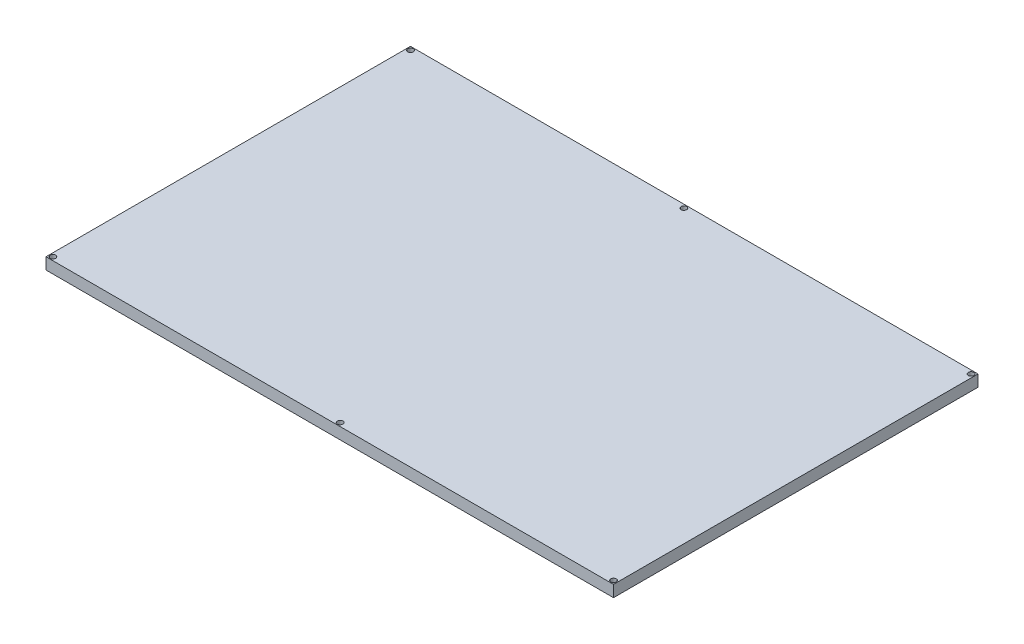
ISO-10303-21;
HEADER;
FILE_DESCRIPTION(('STEP AP214'),'2;1');
FILE_NAME('part.step','',(''),(''),'','','');
FILE_SCHEMA(('AUTOMOTIVE_DESIGN { 1 0 10303 214 1 1 1 1 }'));
ENDSEC;
DATA;
#1=APPLICATION_CONTEXT('core data for automotive mechanical design processes');
#2=APPLICATION_PROTOCOL_DEFINITION('international standard','automotive_design',2000,#1);
#3=PRODUCT_CONTEXT('',#1,'mechanical');
#4=PRODUCT('Part','Part','',(#3));
#5=PRODUCT_RELATED_PRODUCT_CATEGORY('part','',(#4));
#6=PRODUCT_DEFINITION_FORMATION('','',#4);
#7=PRODUCT_DEFINITION_CONTEXT('part definition',#1,'design');
#8=PRODUCT_DEFINITION('design','',#6,#7);
#9=PRODUCT_DEFINITION_SHAPE('','',#8);
#10=(LENGTH_UNIT() NAMED_UNIT(*) SI_UNIT(.MILLI.,.METRE.));
#11=(NAMED_UNIT(*) PLANE_ANGLE_UNIT() SI_UNIT($,.RADIAN.));
#12=(NAMED_UNIT(*) SI_UNIT($,.STERADIAN.) SOLID_ANGLE_UNIT());
#13=UNCERTAINTY_MEASURE_WITH_UNIT(LENGTH_MEASURE(1.E-05),#10,'distance_accuracy_value','');
#14=(GEOMETRIC_REPRESENTATION_CONTEXT(3) GLOBAL_UNCERTAINTY_ASSIGNED_CONTEXT((#13)) GLOBAL_UNIT_ASSIGNED_CONTEXT((#10,
#11,#12)) REPRESENTATION_CONTEXT('',''));
#15=CARTESIAN_POINT('',(0.,0.,0.));
#16=DIRECTION('',(0.,0.,1.));
#17=DIRECTION('',(1.,0.,0.));
#18=AXIS2_PLACEMENT_3D('',#15,#16,#17);
#19=CARTESIAN_POINT('',(-123.,5.,-79.));
#20=DIRECTION('',(1.,0.,0.));
#21=DIRECTION('',(0.,0.,-1.));
#22=AXIS2_PLACEMENT_3D('',#19,#20,#21);
#23=PLANE('',#22);
#24=DIRECTION('',(0.,0.,1.));
#25=VECTOR('',#24,1.);
#26=CARTESIAN_POINT('',(-123.,0.,-79.));
#27=LINE('',#26,#25);
#28=CARTESIAN_POINT('',(-123.,0.,-79.));
#29=VERTEX_POINT('',#28);
#30=CARTESIAN_POINT('',(-123.,0.,79.));
#31=VERTEX_POINT('',#30);
#32=EDGE_CURVE('E118',#29,#31,#27,.T.);
#33=ORIENTED_EDGE('',*,*,#32,.T.);
#34=DIRECTION('',(0.,-1.,0.));
#35=VECTOR('',#34,1.);
#36=CARTESIAN_POINT('',(-123.,5.,79.));
#37=LINE('',#36,#35);
#38=CARTESIAN_POINT('',(-123.,5.,79.));
#39=VERTEX_POINT('',#38);
#40=EDGE_CURVE('E12',#39,#31,#37,.T.);
#41=ORIENTED_EDGE('',*,*,#40,.F.);
#42=DIRECTION('',(0.,0.,1.));
#43=VECTOR('',#42,1.);
#44=CARTESIAN_POINT('',(-123.,5.,-79.));
#45=LINE('',#44,#43);
#46=CARTESIAN_POINT('',(-123.,5.,-79.));
#47=VERTEX_POINT('',#46);
#48=EDGE_CURVE('E102',#47,#39,#45,.T.);
#49=ORIENTED_EDGE('',*,*,#48,.F.);
#50=DIRECTION('',(0.,-1.,0.));
#51=VECTOR('',#50,1.);
#52=CARTESIAN_POINT('',(-123.,5.,-79.));
#53=LINE('',#52,#51);
#54=EDGE_CURVE('E113',#47,#29,#53,.T.);
#55=ORIENTED_EDGE('',*,*,#54,.T.);
#56=EDGE_LOOP('',(#33,#41,#49,#55));
#57=FACE_BOUND('',#56,.T.);
#58=ADVANCED_FACE('F50',(#57),#23,.F.);
#59=CARTESIAN_POINT('',(-123.,5.,79.));
#60=DIRECTION('',(0.,0.,-1.));
#61=DIRECTION('',(-1.,0.,0.));
#62=AXIS2_PLACEMENT_3D('',#59,#60,#61);
#63=PLANE('',#62);
#64=DIRECTION('',(1.,0.,0.));
#65=VECTOR('',#64,1.);
#66=CARTESIAN_POINT('',(-123.,0.,79.));
#67=LINE('',#66,#65);
#68=CARTESIAN_POINT('',(123.,0.,79.));
#69=VERTEX_POINT('',#68);
#70=EDGE_CURVE('E106',#31,#69,#67,.T.);
#71=ORIENTED_EDGE('',*,*,#70,.T.);
#72=DIRECTION('',(0.,-1.,0.));
#73=VECTOR('',#72,1.);
#74=CARTESIAN_POINT('',(123.,5.,79.));
#75=LINE('',#74,#73);
#76=CARTESIAN_POINT('',(123.,5.,79.));
#77=VERTEX_POINT('',#76);
#78=EDGE_CURVE('E59',#77,#69,#75,.T.);
#79=ORIENTED_EDGE('',*,*,#78,.F.);
#80=DIRECTION('',(1.,0.,0.));
#81=VECTOR('',#80,1.);
#82=CARTESIAN_POINT('',(-123.,5.,79.));
#83=LINE('',#82,#81);
#84=EDGE_CURVE('E97',#39,#77,#83,.T.);
#85=ORIENTED_EDGE('',*,*,#84,.F.);
#86=ORIENTED_EDGE('',*,*,#40,.T.);
#87=EDGE_LOOP('',(#71,#79,#85,#86));
#88=FACE_BOUND('',#87,.T.);
#89=ADVANCED_FACE('F105',(#88),#63,.F.);
#90=CARTESIAN_POINT('',(123.,5.,-79.));
#91=DIRECTION('',(-1.,0.,0.));
#92=DIRECTION('',(0.,0.,1.));
#93=AXIS2_PLACEMENT_3D('',#90,#91,#92);
#94=PLANE('',#93);
#95=DIRECTION('',(0.,0.,-1.));
#96=VECTOR('',#95,1.);
#97=CARTESIAN_POINT('',(123.,0.,-79.));
#98=LINE('',#97,#96);
#99=CARTESIAN_POINT('',(123.,0.,-79.));
#100=VERTEX_POINT('',#99);
#101=EDGE_CURVE('E84',#69,#100,#98,.T.);
#102=ORIENTED_EDGE('',*,*,#101,.T.);
#103=DIRECTION('',(0.,-1.,0.));
#104=VECTOR('',#103,1.);
#105=CARTESIAN_POINT('',(123.,5.,-79.));
#106=LINE('',#105,#104);
#107=CARTESIAN_POINT('',(123.,5.,-79.));
#108=VERTEX_POINT('',#107);
#109=EDGE_CURVE('E108',#108,#100,#106,.T.);
#110=ORIENTED_EDGE('',*,*,#109,.F.);
#111=DIRECTION('',(0.,0.,-1.));
#112=VECTOR('',#111,1.);
#113=CARTESIAN_POINT('',(123.,5.,-79.));
#114=LINE('',#113,#112);
#115=EDGE_CURVE('E100',#77,#108,#114,.T.);
#116=ORIENTED_EDGE('',*,*,#115,.F.);
#117=ORIENTED_EDGE('',*,*,#78,.T.);
#118=EDGE_LOOP('',(#102,#110,#116,#117));
#119=FACE_BOUND('',#118,.T.);
#120=ADVANCED_FACE('F109',(#119),#94,.F.);
#121=CARTESIAN_POINT('',(-123.,5.,-79.));
#122=DIRECTION('',(0.,0.,1.));
#123=DIRECTION('',(1.,0.,0.));
#124=AXIS2_PLACEMENT_3D('',#121,#122,#123);
#125=PLANE('',#124);
#126=DIRECTION('',(-1.,0.,0.));
#127=VECTOR('',#126,1.);
#128=CARTESIAN_POINT('',(-123.,0.,-79.));
#129=LINE('',#128,#127);
#130=EDGE_CURVE('E90',#100,#29,#129,.T.);
#131=ORIENTED_EDGE('',*,*,#130,.T.);
#132=ORIENTED_EDGE('',*,*,#54,.F.);
#133=DIRECTION('',(-1.,0.,0.));
#134=VECTOR('',#133,1.);
#135=CARTESIAN_POINT('',(-123.,5.,-79.));
#136=LINE('',#135,#134);
#137=EDGE_CURVE('E67',#108,#47,#136,.T.);
#138=ORIENTED_EDGE('',*,*,#137,.F.);
#139=ORIENTED_EDGE('',*,*,#109,.T.);
#140=EDGE_LOOP('',(#131,#132,#138,#139));
#141=FACE_BOUND('',#140,.T.);
#142=ADVANCED_FACE('F135',(#141),#125,.F.);
#143=CARTESIAN_POINT('',(0.,5.,0.));
#144=DIRECTION('',(0.,1.,0.));
#145=DIRECTION('',(0.,0.,1.));
#146=AXIS2_PLACEMENT_3D('',#143,#144,#145);
#147=PLANE('',#146);
#148=CARTESIAN_POINT('',(-121.5,5.,-77.5));
#149=DIRECTION('',(0.,1.,0.));
#150=DIRECTION('',(0.,0.,1.));
#151=AXIS2_PLACEMENT_3D('',#148,#149,#150);
#152=CIRCLE('',#151,1.19999999999999);
#153=CARTESIAN_POINT('',(-121.5,5.,-76.3));
#154=VERTEX_POINT('',#153);
#155=EDGE_CURVE('E186',#154,#154,#152,.T.);
#156=ORIENTED_EDGE('',*,*,#155,.F.);
#157=EDGE_LOOP('',(#156));
#158=FACE_BOUND('',#157,.T.);
#159=CARTESIAN_POINT('',(-2.99999999999998,5.,-77.5));
#160=DIRECTION('',(0.,1.,0.));
#161=DIRECTION('',(0.,0.,1.));
#162=AXIS2_PLACEMENT_3D('',#159,#160,#161);
#163=CIRCLE('',#162,1.2);
#164=CARTESIAN_POINT('',(-2.99999999999998,5.,-76.3));
#165=VERTEX_POINT('',#164);
#166=EDGE_CURVE('E178',#165,#165,#163,.T.);
#167=ORIENTED_EDGE('',*,*,#166,.F.);
#168=EDGE_LOOP('',(#167));
#169=FACE_BOUND('',#168,.T.);
#170=CARTESIAN_POINT('',(121.5,5.,-77.5));
#171=DIRECTION('',(0.,1.,0.));
#172=DIRECTION('',(0.,0.,1.));
#173=AXIS2_PLACEMENT_3D('',#170,#171,#172);
#174=CIRCLE('',#173,1.19999999999999);
#175=CARTESIAN_POINT('',(121.5,5.,-76.3));
#176=VERTEX_POINT('',#175);
#177=EDGE_CURVE('E170',#176,#176,#174,.T.);
#178=ORIENTED_EDGE('',*,*,#177,.F.);
#179=EDGE_LOOP('',(#178));
#180=FACE_BOUND('',#179,.T.);
#181=CARTESIAN_POINT('',(121.5,5.,77.5));
#182=DIRECTION('',(0.,1.,0.));
#183=DIRECTION('',(0.,0.,1.));
#184=AXIS2_PLACEMENT_3D('',#181,#182,#183);
#185=CIRCLE('',#184,1.19999999999999);
#186=CARTESIAN_POINT('',(121.5,5.,78.7));
#187=VERTEX_POINT('',#186);
#188=EDGE_CURVE('E162',#187,#187,#185,.T.);
#189=ORIENTED_EDGE('',*,*,#188,.F.);
#190=EDGE_LOOP('',(#189));
#191=FACE_BOUND('',#190,.T.);
#192=CARTESIAN_POINT('',(3.00000000000003,5.,77.5));
#193=DIRECTION('',(0.,1.,0.));
#194=DIRECTION('',(0.,0.,1.));
#195=AXIS2_PLACEMENT_3D('',#192,#193,#194);
#196=CIRCLE('',#195,1.2);
#197=CARTESIAN_POINT('',(3.00000000000003,5.,78.7));
#198=VERTEX_POINT('',#197);
#199=EDGE_CURVE('E154',#198,#198,#196,.T.);
#200=ORIENTED_EDGE('',*,*,#199,.F.);
#201=EDGE_LOOP('',(#200));
#202=FACE_BOUND('',#201,.T.);
#203=CARTESIAN_POINT('',(-121.5,5.,77.5));
#204=DIRECTION('',(0.,1.,0.));
#205=DIRECTION('',(0.,0.,1.));
#206=AXIS2_PLACEMENT_3D('',#203,#204,#205);
#207=CIRCLE('',#206,1.19999999999999);
#208=CARTESIAN_POINT('',(-121.5,5.,78.7));
#209=VERTEX_POINT('',#208);
#210=EDGE_CURVE('E146',#209,#209,#207,.T.);
#211=ORIENTED_EDGE('',*,*,#210,.F.);
#212=EDGE_LOOP('',(#211));
#213=FACE_BOUND('',#212,.T.);
#214=ORIENTED_EDGE('',*,*,#48,.T.);
#215=ORIENTED_EDGE('',*,*,#84,.T.);
#216=ORIENTED_EDGE('',*,*,#115,.T.);
#217=ORIENTED_EDGE('',*,*,#137,.T.);
#218=EDGE_LOOP('',(#214,#215,#216,#217));
#219=FACE_BOUND('',#218,.T.);
#220=ADVANCED_FACE('F98',(#158,#169,#180,#191,#202,#213,#219),#147,.T.);
#221=CARTESIAN_POINT('',(0.,0.,0.));
#222=DIRECTION('',(0.,1.,0.));
#223=DIRECTION('',(0.,0.,1.));
#224=AXIS2_PLACEMENT_3D('',#221,#222,#223);
#225=PLANE('',#224);
#226=CARTESIAN_POINT('',(-121.5,0.,-77.5));
#227=DIRECTION('',(0.,1.,0.));
#228=DIRECTION('',(0.,0.,1.));
#229=AXIS2_PLACEMENT_3D('',#226,#227,#228);
#230=CIRCLE('',#229,1.19999999999999);
#231=CARTESIAN_POINT('',(-121.5,0.,-76.3));
#232=VERTEX_POINT('',#231);
#233=EDGE_CURVE('E182',#232,#232,#230,.T.);
#234=ORIENTED_EDGE('',*,*,#233,.T.);
#235=EDGE_LOOP('',(#234));
#236=FACE_BOUND('',#235,.T.);
#237=CARTESIAN_POINT('',(-2.99999999999998,0.,-77.5));
#238=DIRECTION('',(0.,1.,0.));
#239=DIRECTION('',(0.,0.,1.));
#240=AXIS2_PLACEMENT_3D('',#237,#238,#239);
#241=CIRCLE('',#240,1.2);
#242=CARTESIAN_POINT('',(-2.99999999999998,0.,-76.3));
#243=VERTEX_POINT('',#242);
#244=EDGE_CURVE('E174',#243,#243,#241,.T.);
#245=ORIENTED_EDGE('',*,*,#244,.T.);
#246=EDGE_LOOP('',(#245));
#247=FACE_BOUND('',#246,.T.);
#248=CARTESIAN_POINT('',(121.5,0.,-77.5));
#249=DIRECTION('',(0.,1.,0.));
#250=DIRECTION('',(0.,0.,1.));
#251=AXIS2_PLACEMENT_3D('',#248,#249,#250);
#252=CIRCLE('',#251,1.19999999999999);
#253=CARTESIAN_POINT('',(121.5,0.,-76.3));
#254=VERTEX_POINT('',#253);
#255=EDGE_CURVE('E166',#254,#254,#252,.T.);
#256=ORIENTED_EDGE('',*,*,#255,.T.);
#257=EDGE_LOOP('',(#256));
#258=FACE_BOUND('',#257,.T.);
#259=CARTESIAN_POINT('',(121.5,0.,77.5));
#260=DIRECTION('',(0.,1.,0.));
#261=DIRECTION('',(0.,0.,1.));
#262=AXIS2_PLACEMENT_3D('',#259,#260,#261);
#263=CIRCLE('',#262,1.19999999999999);
#264=CARTESIAN_POINT('',(121.5,0.,78.7));
#265=VERTEX_POINT('',#264);
#266=EDGE_CURVE('E158',#265,#265,#263,.T.);
#267=ORIENTED_EDGE('',*,*,#266,.T.);
#268=EDGE_LOOP('',(#267));
#269=FACE_BOUND('',#268,.T.);
#270=CARTESIAN_POINT('',(3.00000000000003,0.,77.5));
#271=DIRECTION('',(0.,1.,0.));
#272=DIRECTION('',(0.,0.,1.));
#273=AXIS2_PLACEMENT_3D('',#270,#271,#272);
#274=CIRCLE('',#273,1.2);
#275=CARTESIAN_POINT('',(3.00000000000003,0.,78.7));
#276=VERTEX_POINT('',#275);
#277=EDGE_CURVE('E150',#276,#276,#274,.T.);
#278=ORIENTED_EDGE('',*,*,#277,.T.);
#279=EDGE_LOOP('',(#278));
#280=FACE_BOUND('',#279,.T.);
#281=CARTESIAN_POINT('',(-121.5,0.,77.5));
#282=DIRECTION('',(0.,1.,0.));
#283=DIRECTION('',(0.,0.,1.));
#284=AXIS2_PLACEMENT_3D('',#281,#282,#283);
#285=CIRCLE('',#284,1.19999999999999);
#286=CARTESIAN_POINT('',(-121.5,0.,78.7));
#287=VERTEX_POINT('',#286);
#288=EDGE_CURVE('E122',#287,#287,#285,.T.);
#289=ORIENTED_EDGE('',*,*,#288,.T.);
#290=EDGE_LOOP('',(#289));
#291=FACE_BOUND('',#290,.T.);
#292=ORIENTED_EDGE('',*,*,#32,.F.);
#293=ORIENTED_EDGE('',*,*,#130,.F.);
#294=ORIENTED_EDGE('',*,*,#101,.F.);
#295=ORIENTED_EDGE('',*,*,#70,.F.);
#296=EDGE_LOOP('',(#292,#293,#294,#295));
#297=FACE_BOUND('',#296,.T.);
#298=ADVANCED_FACE('F138',(#236,#247,#258,#269,#280,#291,#297),#225,.F.);
#299=CARTESIAN_POINT('',(-121.5,5.,77.5));
#300=DIRECTION('',(0.,1.,0.));
#301=DIRECTION('',(0.,0.,1.));
#302=AXIS2_PLACEMENT_3D('',#299,#300,#301);
#303=CYLINDRICAL_SURFACE('',#302,1.19999999999999);
#304=ORIENTED_EDGE('',*,*,#288,.F.);
#305=EDGE_LOOP('',(#304));
#306=FACE_BOUND('',#305,.T.);
#307=ORIENTED_EDGE('',*,*,#210,.T.);
#308=EDGE_LOOP('',(#307));
#309=FACE_BOUND('',#308,.T.);
#310=ADVANCED_FACE('F206',(#306,#309),#303,.F.);
#311=CARTESIAN_POINT('',(3.00000000000003,5.,77.5));
#312=DIRECTION('',(0.,1.,0.));
#313=DIRECTION('',(0.,0.,1.));
#314=AXIS2_PLACEMENT_3D('',#311,#312,#313);
#315=CYLINDRICAL_SURFACE('',#314,1.2);
#316=ORIENTED_EDGE('',*,*,#277,.F.);
#317=EDGE_LOOP('',(#316));
#318=FACE_BOUND('',#317,.T.);
#319=ORIENTED_EDGE('',*,*,#199,.T.);
#320=EDGE_LOOP('',(#319));
#321=FACE_BOUND('',#320,.T.);
#322=ADVANCED_FACE('F208',(#318,#321),#315,.F.);
#323=CARTESIAN_POINT('',(121.5,5.,77.5));
#324=DIRECTION('',(0.,1.,0.));
#325=DIRECTION('',(0.,0.,1.));
#326=AXIS2_PLACEMENT_3D('',#323,#324,#325);
#327=CYLINDRICAL_SURFACE('',#326,1.19999999999999);
#328=ORIENTED_EDGE('',*,*,#266,.F.);
#329=EDGE_LOOP('',(#328));
#330=FACE_BOUND('',#329,.T.);
#331=ORIENTED_EDGE('',*,*,#188,.T.);
#332=EDGE_LOOP('',(#331));
#333=FACE_BOUND('',#332,.T.);
#334=ADVANCED_FACE('F215',(#330,#333),#327,.F.);
#335=CARTESIAN_POINT('',(121.5,5.,-77.5));
#336=DIRECTION('',(0.,1.,0.));
#337=DIRECTION('',(0.,0.,1.));
#338=AXIS2_PLACEMENT_3D('',#335,#336,#337);
#339=CYLINDRICAL_SURFACE('',#338,1.19999999999999);
#340=ORIENTED_EDGE('',*,*,#255,.F.);
#341=EDGE_LOOP('',(#340));
#342=FACE_BOUND('',#341,.T.);
#343=ORIENTED_EDGE('',*,*,#177,.T.);
#344=EDGE_LOOP('',(#343));
#345=FACE_BOUND('',#344,.T.);
#346=ADVANCED_FACE('F266',(#342,#345),#339,.F.);
#347=CARTESIAN_POINT('',(-2.99999999999998,5.,-77.5));
#348=DIRECTION('',(0.,1.,0.));
#349=DIRECTION('',(0.,0.,1.));
#350=AXIS2_PLACEMENT_3D('',#347,#348,#349);
#351=CYLINDRICAL_SURFACE('',#350,1.2);
#352=ORIENTED_EDGE('',*,*,#244,.F.);
#353=EDGE_LOOP('',(#352));
#354=FACE_BOUND('',#353,.T.);
#355=ORIENTED_EDGE('',*,*,#166,.T.);
#356=EDGE_LOOP('',(#355));
#357=FACE_BOUND('',#356,.T.);
#358=ADVANCED_FACE('F277',(#354,#357),#351,.F.);
#359=CARTESIAN_POINT('',(-121.5,5.,-77.5));
#360=DIRECTION('',(0.,1.,0.));
#361=DIRECTION('',(0.,0.,1.));
#362=AXIS2_PLACEMENT_3D('',#359,#360,#361);
#363=CYLINDRICAL_SURFACE('',#362,1.19999999999999);
#364=ORIENTED_EDGE('',*,*,#233,.F.);
#365=EDGE_LOOP('',(#364));
#366=FACE_BOUND('',#365,.T.);
#367=ORIENTED_EDGE('',*,*,#155,.T.);
#368=EDGE_LOOP('',(#367));
#369=FACE_BOUND('',#368,.T.);
#370=ADVANCED_FACE('F191',(#366,#369),#363,.F.);
#371=CLOSED_SHELL('',(#58,#89,#120,#142,#220,#298,#310,#322,#334,#346,#358,#370));
#372=MANIFOLD_SOLID_BREP('B2',#371);
#373=ADVANCED_BREP_SHAPE_REPRESENTATION('',(#18,#372),#14);
#374=SHAPE_DEFINITION_REPRESENTATION(#9,#373);
ENDSEC;
END-ISO-10303-21;
